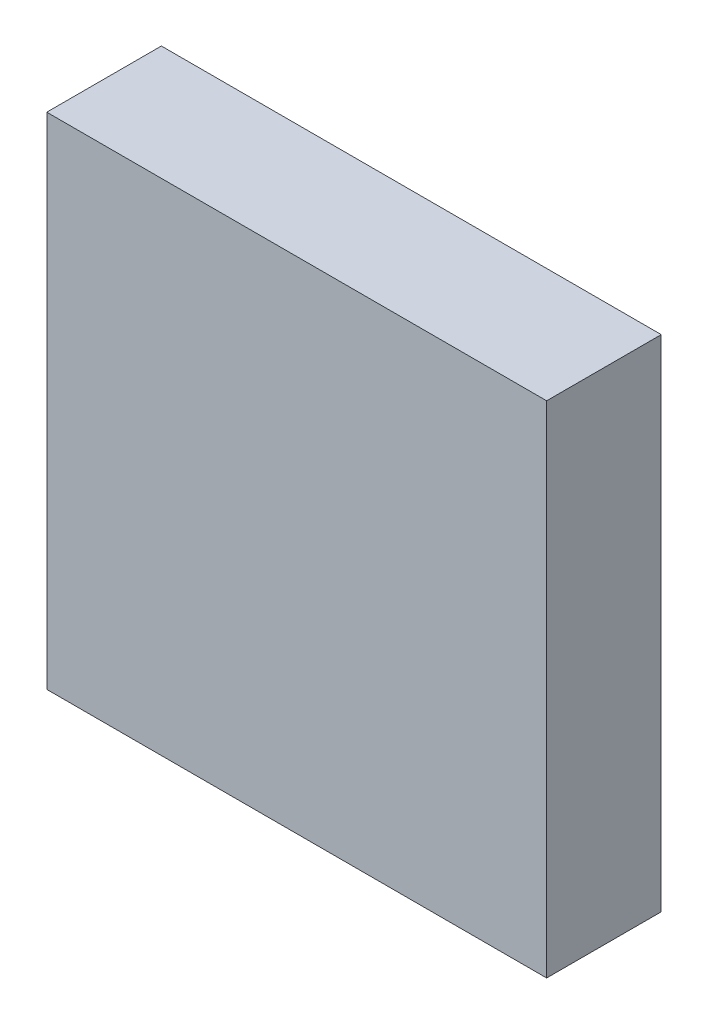
ISO-10303-21;
HEADER;
FILE_DESCRIPTION(('STEP AP214'),'2;1');
FILE_NAME('part.step','',(''),(''),'','','');
FILE_SCHEMA(('AUTOMOTIVE_DESIGN { 1 0 10303 214 1 1 1 1 }'));
ENDSEC;
DATA;
#1=APPLICATION_CONTEXT('core data for automotive mechanical design processes');
#2=APPLICATION_PROTOCOL_DEFINITION('international standard','automotive_design',2000,#1);
#3=PRODUCT_CONTEXT('',#1,'mechanical');
#4=PRODUCT('Part','Part','',(#3));
#5=PRODUCT_RELATED_PRODUCT_CATEGORY('part','',(#4));
#6=PRODUCT_DEFINITION_FORMATION('','',#4);
#7=PRODUCT_DEFINITION_CONTEXT('part definition',#1,'design');
#8=PRODUCT_DEFINITION('design','',#6,#7);
#9=PRODUCT_DEFINITION_SHAPE('','',#8);
#10=(LENGTH_UNIT() NAMED_UNIT(*) SI_UNIT(.MILLI.,.METRE.));
#11=(NAMED_UNIT(*) PLANE_ANGLE_UNIT() SI_UNIT($,.RADIAN.));
#12=(NAMED_UNIT(*) SI_UNIT($,.STERADIAN.) SOLID_ANGLE_UNIT());
#13=UNCERTAINTY_MEASURE_WITH_UNIT(LENGTH_MEASURE(1.E-05),#10,'distance_accuracy_value','');
#14=(GEOMETRIC_REPRESENTATION_CONTEXT(3) GLOBAL_UNCERTAINTY_ASSIGNED_CONTEXT((#13)) GLOBAL_UNIT_ASSIGNED_CONTEXT((#10,
#11,#12)) REPRESENTATION_CONTEXT('',''));
#15=CARTESIAN_POINT('',(0.,0.,0.));
#16=DIRECTION('',(0.,0.,1.));
#17=DIRECTION('',(1.,0.,0.));
#18=AXIS2_PLACEMENT_3D('',#15,#16,#17);
#19=CARTESIAN_POINT('',(-2.04999844,2.05000098,0.94000066));
#20=DIRECTION('',(0.,0.,-1.));
#21=DIRECTION('',(-1.,0.,0.));
#22=AXIS2_PLACEMENT_3D('',#19,#20,#21);
#23=PLANE('',#22);
#24=DIRECTION('',(1.,0.,0.));
#25=VECTOR('',#24,1.);
#26=CARTESIAN_POINT('',(-2.04999844,-2.04999844,0.94000066));
#27=LINE('',#26,#25);
#28=CARTESIAN_POINT('',(-2.04999844,-2.04999844,0.94000066));
#29=VERTEX_POINT('',#28);
#30=CARTESIAN_POINT('',(2.05000098,-2.04999844,0.94000066));
#31=VERTEX_POINT('',#30);
#32=EDGE_CURVE('E55',#29,#31,#27,.T.);
#33=ORIENTED_EDGE('',*,*,#32,.T.);
#34=DIRECTION('',(0.,1.,0.));
#35=VECTOR('',#34,1.);
#36=CARTESIAN_POINT('',(2.05000098,-2.04999844,0.94000066));
#37=LINE('',#36,#35);
#38=CARTESIAN_POINT('',(2.05000098,2.05000098,0.94000066));
#39=VERTEX_POINT('',#38);
#40=EDGE_CURVE('E57',#31,#39,#37,.T.);
#41=ORIENTED_EDGE('',*,*,#40,.T.);
#42=DIRECTION('',(1.,0.,0.));
#43=VECTOR('',#42,1.);
#44=CARTESIAN_POINT('',(2.05000098,2.05000098,0.94000066));
#45=LINE('',#44,#43);
#46=CARTESIAN_POINT('',(-2.04999844,2.05000098,0.94000066));
#47=VERTEX_POINT('',#46);
#48=EDGE_CURVE('E20',#39,#47,#45,.F.);
#49=ORIENTED_EDGE('',*,*,#48,.T.);
#50=DIRECTION('',(0.,1.,0.));
#51=VECTOR('',#50,1.);
#52=CARTESIAN_POINT('',(-2.04999844,2.05000098,0.94000066));
#53=LINE('',#52,#51);
#54=EDGE_CURVE('E80',#47,#29,#53,.F.);
#55=ORIENTED_EDGE('',*,*,#54,.T.);
#56=EDGE_LOOP('',(#33,#41,#49,#55));
#57=FACE_BOUND('',#56,.T.);
#58=ADVANCED_FACE('F17',(#57),#23,.F.);
#59=CARTESIAN_POINT('',(2.05000098,2.05000098,0.));
#60=DIRECTION('',(0.,-1.,0.));
#61=DIRECTION('',(0.,0.,-1.));
#62=AXIS2_PLACEMENT_3D('',#59,#60,#61);
#63=PLANE('',#62);
#64=DIRECTION('',(0.,0.,-1.));
#65=VECTOR('',#64,1.);
#66=CARTESIAN_POINT('',(-2.04999844,2.05000098,0.));
#67=LINE('',#66,#65);
#68=CARTESIAN_POINT('',(-2.04999844,2.05000098,0.));
#69=VERTEX_POINT('',#68);
#70=EDGE_CURVE('E68',#69,#47,#67,.F.);
#71=ORIENTED_EDGE('',*,*,#70,.T.);
#72=ORIENTED_EDGE('',*,*,#48,.F.);
#73=DIRECTION('',(0.,0.,1.));
#74=VECTOR('',#73,1.);
#75=CARTESIAN_POINT('',(2.05000098,2.05000098,0.));
#76=LINE('',#75,#74);
#77=CARTESIAN_POINT('',(2.05000098,2.05000098,0.));
#78=VERTEX_POINT('',#77);
#79=EDGE_CURVE('E63',#39,#78,#76,.F.);
#80=ORIENTED_EDGE('',*,*,#79,.T.);
#81=DIRECTION('',(-1.,0.,0.));
#82=VECTOR('',#81,1.);
#83=CARTESIAN_POINT('',(-2.04999844,2.05000098,0.));
#84=LINE('',#83,#82);
#85=EDGE_CURVE('E83',#69,#78,#84,.F.);
#86=ORIENTED_EDGE('',*,*,#85,.F.);
#87=EDGE_LOOP('',(#71,#72,#80,#86));
#88=FACE_BOUND('',#87,.T.);
#89=ADVANCED_FACE('F65',(#88),#63,.F.);
#90=CARTESIAN_POINT('',(2.05000098,-2.04999844,0.));
#91=DIRECTION('',(-1.,0.,0.));
#92=DIRECTION('',(0.,0.,1.));
#93=AXIS2_PLACEMENT_3D('',#90,#91,#92);
#94=PLANE('',#93);
#95=ORIENTED_EDGE('',*,*,#79,.F.);
#96=ORIENTED_EDGE('',*,*,#40,.F.);
#97=DIRECTION('',(0.,0.,1.));
#98=VECTOR('',#97,1.);
#99=CARTESIAN_POINT('',(2.05000098,-2.04999844,0.));
#100=LINE('',#99,#98);
#101=CARTESIAN_POINT('',(2.05000098,-2.04999844,0.));
#102=VERTEX_POINT('',#101);
#103=EDGE_CURVE('E75',#31,#102,#100,.F.);
#104=ORIENTED_EDGE('',*,*,#103,.T.);
#105=DIRECTION('',(0.,1.,0.));
#106=VECTOR('',#105,1.);
#107=CARTESIAN_POINT('',(2.05000098,2.05000098,0.));
#108=LINE('',#107,#106);
#109=EDGE_CURVE('E72',#78,#102,#108,.F.);
#110=ORIENTED_EDGE('',*,*,#109,.F.);
#111=EDGE_LOOP('',(#95,#96,#104,#110));
#112=FACE_BOUND('',#111,.T.);
#113=ADVANCED_FACE('F70',(#112),#94,.F.);
#114=CARTESIAN_POINT('',(-2.04999844,-2.04999844,0.));
#115=DIRECTION('',(0.,1.,0.));
#116=DIRECTION('',(0.,0.,1.));
#117=AXIS2_PLACEMENT_3D('',#114,#115,#116);
#118=PLANE('',#117);
#119=ORIENTED_EDGE('',*,*,#103,.F.);
#120=ORIENTED_EDGE('',*,*,#32,.F.);
#121=DIRECTION('',(0.,0.,-1.));
#122=VECTOR('',#121,1.);
#123=CARTESIAN_POINT('',(-2.04999844,-2.04999844,0.));
#124=LINE('',#123,#122);
#125=CARTESIAN_POINT('',(-2.04999844,-2.04999844,0.));
#126=VERTEX_POINT('',#125);
#127=EDGE_CURVE('E35',#29,#126,#124,.T.);
#128=ORIENTED_EDGE('',*,*,#127,.T.);
#129=DIRECTION('',(-1.,0.,0.));
#130=VECTOR('',#129,1.);
#131=CARTESIAN_POINT('',(-2.04999844,-2.04999844,0.));
#132=LINE('',#131,#130);
#133=EDGE_CURVE('E26',#102,#126,#132,.T.);
#134=ORIENTED_EDGE('',*,*,#133,.F.);
#135=EDGE_LOOP('',(#119,#120,#128,#134));
#136=FACE_BOUND('',#135,.T.);
#137=ADVANCED_FACE('F89',(#136),#118,.F.);
#138=CARTESIAN_POINT('',(-2.04999844,2.05000098,0.));
#139=DIRECTION('',(1.,0.,0.));
#140=DIRECTION('',(0.,0.,-1.));
#141=AXIS2_PLACEMENT_3D('',#138,#139,#140);
#142=PLANE('',#141);
#143=ORIENTED_EDGE('',*,*,#127,.F.);
#144=ORIENTED_EDGE('',*,*,#54,.F.);
#145=ORIENTED_EDGE('',*,*,#70,.F.);
#146=DIRECTION('',(0.,1.,0.));
#147=VECTOR('',#146,1.);
#148=CARTESIAN_POINT('',(-2.04999844,2.05000098,0.));
#149=LINE('',#148,#147);
#150=EDGE_CURVE('E11',#126,#69,#149,.T.);
#151=ORIENTED_EDGE('',*,*,#150,.F.);
#152=EDGE_LOOP('',(#143,#144,#145,#151));
#153=FACE_BOUND('',#152,.T.);
#154=ADVANCED_FACE('F91',(#153),#142,.F.);
#155=CARTESIAN_POINT('',(-2.04999844,2.05000098,0.));
#156=DIRECTION('',(0.,0.,-1.));
#157=DIRECTION('',(-1.,0.,0.));
#158=AXIS2_PLACEMENT_3D('',#155,#156,#157);
#159=PLANE('',#158);
#160=ORIENTED_EDGE('',*,*,#133,.T.);
#161=ORIENTED_EDGE('',*,*,#150,.T.);
#162=ORIENTED_EDGE('',*,*,#85,.T.);
#163=ORIENTED_EDGE('',*,*,#109,.T.);
#164=EDGE_LOOP('',(#160,#161,#162,#163));
#165=FACE_BOUND('',#164,.T.);
#166=ADVANCED_FACE('F88',(#165),#159,.T.);
#167=CLOSED_SHELL('',(#58,#89,#113,#137,#154,#166));
#168=MANIFOLD_SOLID_BREP('B1',#167);
#169=ADVANCED_BREP_SHAPE_REPRESENTATION('',(#18,#168),#14);
#170=SHAPE_DEFINITION_REPRESENTATION(#9,#169);
ENDSEC;
END-ISO-10303-21;
